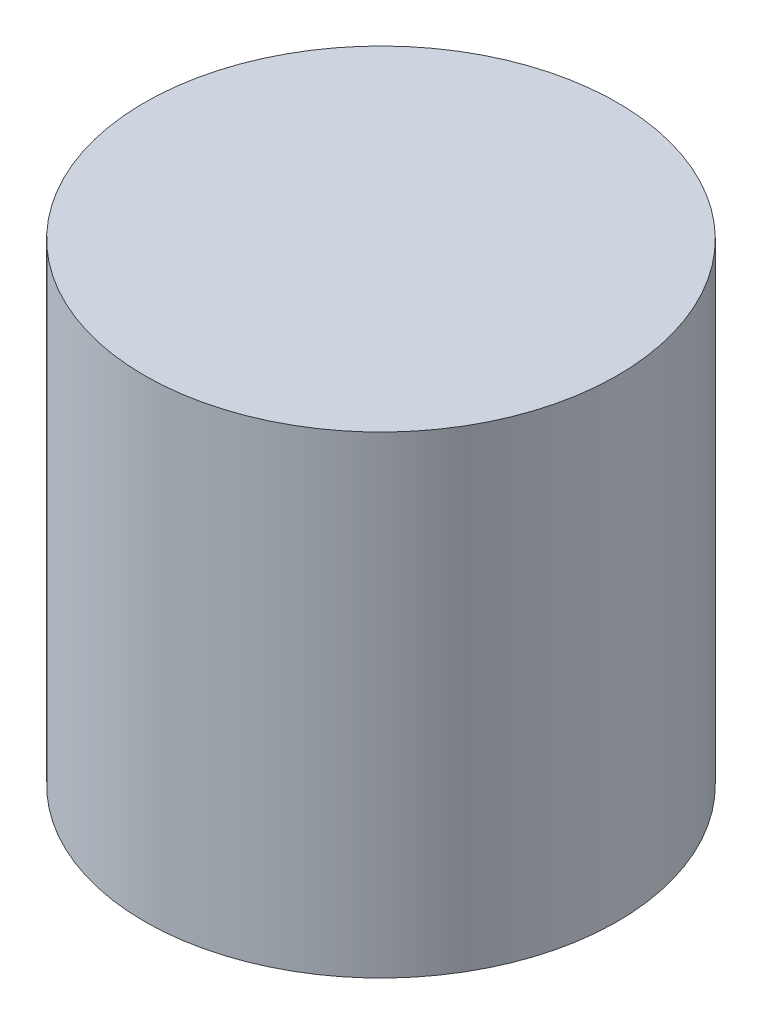
ISO-10303-21;
HEADER;
FILE_DESCRIPTION(('STEP AP214'),'2;1');
FILE_NAME('part.step','',(''),(''),'','','');
FILE_SCHEMA(('AUTOMOTIVE_DESIGN { 1 0 10303 214 1 1 1 1 }'));
ENDSEC;
DATA;
#1=APPLICATION_CONTEXT('core data for automotive mechanical design processes');
#2=APPLICATION_PROTOCOL_DEFINITION('international standard','automotive_design',2000,#1);
#3=PRODUCT_CONTEXT('',#1,'mechanical');
#4=PRODUCT('Part','Part','',(#3));
#5=PRODUCT_RELATED_PRODUCT_CATEGORY('part','',(#4));
#6=PRODUCT_DEFINITION_FORMATION('','',#4);
#7=PRODUCT_DEFINITION_CONTEXT('part definition',#1,'design');
#8=PRODUCT_DEFINITION('design','',#6,#7);
#9=PRODUCT_DEFINITION_SHAPE('','',#8);
#10=(LENGTH_UNIT() NAMED_UNIT(*) SI_UNIT(.MILLI.,.METRE.));
#11=(NAMED_UNIT(*) PLANE_ANGLE_UNIT() SI_UNIT($,.RADIAN.));
#12=(NAMED_UNIT(*) SI_UNIT($,.STERADIAN.) SOLID_ANGLE_UNIT());
#13=UNCERTAINTY_MEASURE_WITH_UNIT(LENGTH_MEASURE(1.E-05),#10,'distance_accuracy_value','');
#14=(GEOMETRIC_REPRESENTATION_CONTEXT(3) GLOBAL_UNCERTAINTY_ASSIGNED_CONTEXT((#13)) GLOBAL_UNIT_ASSIGNED_CONTEXT((#10,
#11,#12)) REPRESENTATION_CONTEXT('',''));
#15=CARTESIAN_POINT('',(0.,0.,0.));
#16=DIRECTION('',(0.,0.,1.));
#17=DIRECTION('',(1.,0.,0.));
#18=AXIS2_PLACEMENT_3D('',#15,#16,#17);
#19=CARTESIAN_POINT('',(0.,500.,0.));
#20=DIRECTION('',(0.,-1.,0.));
#21=DIRECTION('',(0.,0.,-1.));
#22=AXIS2_PLACEMENT_3D('',#19,#20,#21);
#23=CYLINDRICAL_SURFACE('',#22,250.);
#24=CARTESIAN_POINT('',(0.,500.,0.));
#25=DIRECTION('',(0.,1.,0.));
#26=DIRECTION('',(0.,0.,1.));
#27=AXIS2_PLACEMENT_3D('',#24,#25,#26);
#28=CIRCLE('',#27,250.);
#29=CARTESIAN_POINT('',(0.,500.,250.));
#30=VERTEX_POINT('',#29);
#31=EDGE_CURVE('E10',#30,#30,#28,.T.);
#32=ORIENTED_EDGE('',*,*,#31,.F.);
#33=EDGE_LOOP('',(#32));
#34=FACE_BOUND('',#33,.T.);
#35=CARTESIAN_POINT('',(0.,0.,0.));
#36=DIRECTION('',(0.,1.,0.));
#37=DIRECTION('',(0.,0.,1.));
#38=AXIS2_PLACEMENT_3D('',#35,#36,#37);
#39=CIRCLE('',#38,250.);
#40=CARTESIAN_POINT('',(0.,0.,250.));
#41=VERTEX_POINT('',#40);
#42=EDGE_CURVE('E40',#41,#41,#39,.T.);
#43=ORIENTED_EDGE('',*,*,#42,.T.);
#44=EDGE_LOOP('',(#43));
#45=FACE_BOUND('',#44,.T.);
#46=ADVANCED_FACE('F37',(#34,#45),#23,.T.);
#47=CARTESIAN_POINT('',(0.,500.,0.));
#48=DIRECTION('',(0.,1.,0.));
#49=DIRECTION('',(0.,0.,1.));
#50=AXIS2_PLACEMENT_3D('',#47,#48,#49);
#51=PLANE('',#50);
#52=ORIENTED_EDGE('',*,*,#31,.T.);
#53=EDGE_LOOP('',(#52));
#54=FACE_BOUND('',#53,.T.);
#55=ADVANCED_FACE('F54',(#54),#51,.T.);
#56=CARTESIAN_POINT('',(0.,0.,0.));
#57=DIRECTION('',(0.,1.,0.));
#58=DIRECTION('',(0.,0.,1.));
#59=AXIS2_PLACEMENT_3D('',#56,#57,#58);
#60=PLANE('',#59);
#61=ORIENTED_EDGE('',*,*,#42,.F.);
#62=EDGE_LOOP('',(#61));
#63=FACE_BOUND('',#62,.T.);
#64=ADVANCED_FACE('F52',(#63),#60,.F.);
#65=CLOSED_SHELL('',(#46,#55,#64));
#66=MANIFOLD_SOLID_BREP('B2',#65);
#67=ADVANCED_BREP_SHAPE_REPRESENTATION('',(#18,#66),#14);
#68=SHAPE_DEFINITION_REPRESENTATION(#9,#67);
ENDSEC;
END-ISO-10303-21;
